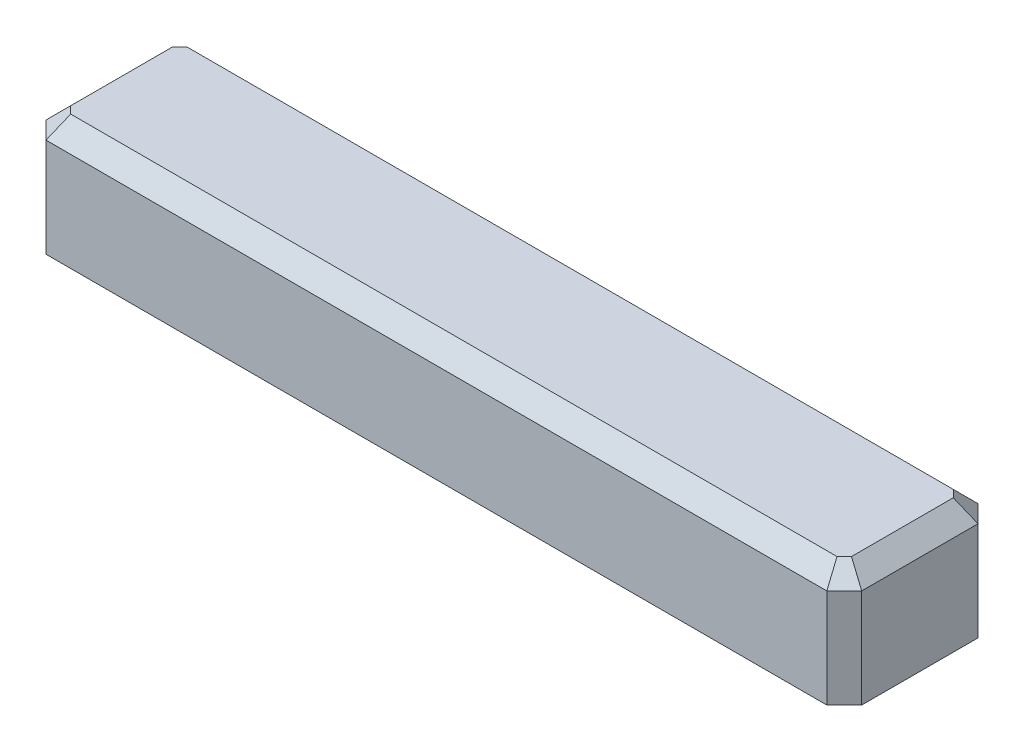
ISO-10303-21;
HEADER;
FILE_DESCRIPTION(('STEP AP214'),'2;1');
FILE_NAME('part.step','',(''),(''),'','','');
FILE_SCHEMA(('AUTOMOTIVE_DESIGN { 1 0 10303 214 1 1 1 1 }'));
ENDSEC;
DATA;
#1=APPLICATION_CONTEXT('core data for automotive mechanical design processes');
#2=APPLICATION_PROTOCOL_DEFINITION('international standard','automotive_design',2000,#1);
#3=PRODUCT_CONTEXT('',#1,'mechanical');
#4=PRODUCT('Part','Part','',(#3));
#5=PRODUCT_RELATED_PRODUCT_CATEGORY('part','',(#4));
#6=PRODUCT_DEFINITION_FORMATION('','',#4);
#7=PRODUCT_DEFINITION_CONTEXT('part definition',#1,'design');
#8=PRODUCT_DEFINITION('design','',#6,#7);
#9=PRODUCT_DEFINITION_SHAPE('','',#8);
#10=(LENGTH_UNIT() NAMED_UNIT(*) SI_UNIT(.MILLI.,.METRE.));
#11=(NAMED_UNIT(*) PLANE_ANGLE_UNIT() SI_UNIT($,.RADIAN.));
#12=(NAMED_UNIT(*) SI_UNIT($,.STERADIAN.) SOLID_ANGLE_UNIT());
#13=UNCERTAINTY_MEASURE_WITH_UNIT(LENGTH_MEASURE(1.E-05),#10,'distance_accuracy_value','');
#14=(GEOMETRIC_REPRESENTATION_CONTEXT(3) GLOBAL_UNCERTAINTY_ASSIGNED_CONTEXT((#13)) GLOBAL_UNIT_ASSIGNED_CONTEXT((#10,
#11,#12)) REPRESENTATION_CONTEXT('',''));
#15=CARTESIAN_POINT('',(0.,0.,0.));
#16=DIRECTION('',(0.,0.,1.));
#17=DIRECTION('',(1.,0.,0.));
#18=AXIS2_PLACEMENT_3D('',#15,#16,#17);
#19=CARTESIAN_POINT('',(-35.07,10.,5.));
#20=DIRECTION('',(1.,0.,0.));
#21=DIRECTION('',(0.,0.,-1.));
#22=AXIS2_PLACEMENT_3D('',#19,#20,#21);
#23=PLANE('',#22);
#24=DIRECTION('',(0.,-1.,0.));
#25=VECTOR('',#24,1.);
#26=CARTESIAN_POINT('',(-35.07,10.,5.));
#27=LINE('',#26,#25);
#28=CARTESIAN_POINT('',(-35.07,8.5,5.));
#29=VERTEX_POINT('',#28);
#30=CARTESIAN_POINT('',(-35.07,0.,5.));
#31=VERTEX_POINT('',#30);
#32=EDGE_CURVE('E265',#29,#31,#27,.T.);
#33=ORIENTED_EDGE('',*,*,#32,.F.);
#34=DIRECTION('',(0.,0.,-1.));
#35=VECTOR('',#34,1.);
#36=CARTESIAN_POINT('',(-35.07,8.5,5.));
#37=LINE('',#36,#35);
#38=CARTESIAN_POINT('',(-35.07,8.5,-5.));
#39=VERTEX_POINT('',#38);
#40=EDGE_CURVE('E297',#29,#39,#37,.T.);
#41=ORIENTED_EDGE('',*,*,#40,.T.);
#42=DIRECTION('',(0.,-1.,0.));
#43=VECTOR('',#42,1.);
#44=CARTESIAN_POINT('',(-35.07,10.,-5.));
#45=LINE('',#44,#43);
#46=CARTESIAN_POINT('',(-35.07,0.,-5.));
#47=VERTEX_POINT('',#46);
#48=EDGE_CURVE('E244',#39,#47,#45,.T.);
#49=ORIENTED_EDGE('',*,*,#48,.T.);
#50=DIRECTION('',(0.,0.,1.));
#51=VECTOR('',#50,1.);
#52=CARTESIAN_POINT('',(-35.07,0.,5.));
#53=LINE('',#52,#51);
#54=EDGE_CURVE('E212',#47,#31,#53,.T.);
#55=ORIENTED_EDGE('',*,*,#54,.T.);
#56=EDGE_LOOP('',(#33,#41,#49,#55));
#57=FACE_BOUND('',#56,.T.);
#58=ADVANCED_FACE('F45',(#57),#23,.F.);
#59=CARTESIAN_POINT('',(-35.07,10.,5.));
#60=DIRECTION('',(0.707106781186548,0.,-0.707106781186548));
#61=DIRECTION('',(-0.707106781186548,0.,-0.707106781186548));
#62=AXIS2_PLACEMENT_3D('',#59,#60,#61);
#63=PLANE('',#62);
#64=DIRECTION('',(0.,-1.,0.));
#65=VECTOR('',#64,1.);
#66=CARTESIAN_POINT('',(-33.57,10.,6.5));
#67=LINE('',#66,#65);
#68=CARTESIAN_POINT('',(-33.57,8.5,6.5));
#69=VERTEX_POINT('',#68);
#70=CARTESIAN_POINT('',(-33.57,0.,6.5));
#71=VERTEX_POINT('',#70);
#72=EDGE_CURVE('E262',#69,#71,#67,.T.);
#73=ORIENTED_EDGE('',*,*,#72,.F.);
#74=DIRECTION('',(-0.707106781186548,0.,-0.707106781186548));
#75=VECTOR('',#74,1.);
#76=CARTESIAN_POINT('',(-35.07,8.5,5.));
#77=LINE('',#76,#75);
#78=EDGE_CURVE('E293',#69,#29,#77,.T.);
#79=ORIENTED_EDGE('',*,*,#78,.T.);
#80=ORIENTED_EDGE('',*,*,#32,.T.);
#81=DIRECTION('',(0.707106781186547,0.,0.707106781186547));
#82=VECTOR('',#81,1.);
#83=CARTESIAN_POINT('',(-35.07,0.,5.));
#84=LINE('',#83,#82);
#85=EDGE_CURVE('E216',#31,#71,#84,.T.);
#86=ORIENTED_EDGE('',*,*,#85,.T.);
#87=EDGE_LOOP('',(#73,#79,#80,#86));
#88=FACE_BOUND('',#87,.T.);
#89=ADVANCED_FACE('F401',(#88),#63,.F.);
#90=CARTESIAN_POINT('',(-33.57,10.,6.5));
#91=DIRECTION('',(0.,0.,-1.));
#92=DIRECTION('',(-1.,0.,0.));
#93=AXIS2_PLACEMENT_3D('',#90,#91,#92);
#94=PLANE('',#93);
#95=DIRECTION('',(0.,-1.,0.));
#96=VECTOR('',#95,1.);
#97=CARTESIAN_POINT('',(33.57,10.,6.5));
#98=LINE('',#97,#96);
#99=CARTESIAN_POINT('',(33.57,8.5,6.5));
#100=VERTEX_POINT('',#99);
#101=CARTESIAN_POINT('',(33.57,0.,6.5));
#102=VERTEX_POINT('',#101);
#103=EDGE_CURVE('E259',#100,#102,#98,.T.);
#104=ORIENTED_EDGE('',*,*,#103,.F.);
#105=DIRECTION('',(-1.,0.,0.));
#106=VECTOR('',#105,1.);
#107=CARTESIAN_POINT('',(-33.57,8.5,6.5));
#108=LINE('',#107,#106);
#109=EDGE_CURVE('E11',#100,#69,#108,.T.);
#110=ORIENTED_EDGE('',*,*,#109,.T.);
#111=ORIENTED_EDGE('',*,*,#72,.T.);
#112=DIRECTION('',(1.,0.,0.));
#113=VECTOR('',#112,1.);
#114=CARTESIAN_POINT('',(-33.57,0.,6.5));
#115=LINE('',#114,#113);
#116=EDGE_CURVE('E220',#71,#102,#115,.T.);
#117=ORIENTED_EDGE('',*,*,#116,.T.);
#118=EDGE_LOOP('',(#104,#110,#111,#117));
#119=FACE_BOUND('',#118,.T.);
#120=ADVANCED_FACE('F398',(#119),#94,.F.);
#121=CARTESIAN_POINT('',(33.57,10.,6.5));
#122=DIRECTION('',(-0.707106781186546,0.,-0.707106781186549));
#123=DIRECTION('',(-0.707106781186549,0.,0.707106781186546));
#124=AXIS2_PLACEMENT_3D('',#121,#122,#123);
#125=PLANE('',#124);
#126=DIRECTION('',(0.,-1.,0.));
#127=VECTOR('',#126,1.);
#128=CARTESIAN_POINT('',(35.07,10.,5.));
#129=LINE('',#128,#127);
#130=CARTESIAN_POINT('',(35.07,8.5,5.));
#131=VERTEX_POINT('',#130);
#132=CARTESIAN_POINT('',(35.07,0.,5.));
#133=VERTEX_POINT('',#132);
#134=EDGE_CURVE('E256',#131,#133,#129,.T.);
#135=ORIENTED_EDGE('',*,*,#134,.F.);
#136=DIRECTION('',(-0.707106781186549,0.,0.707106781186546));
#137=VECTOR('',#136,1.);
#138=CARTESIAN_POINT('',(33.57,8.5,6.5));
#139=LINE('',#138,#137);
#140=EDGE_CURVE('E56',#131,#100,#139,.T.);
#141=ORIENTED_EDGE('',*,*,#140,.T.);
#142=ORIENTED_EDGE('',*,*,#103,.T.);
#143=DIRECTION('',(0.707106781186549,0.,-0.707106781186546));
#144=VECTOR('',#143,1.);
#145=CARTESIAN_POINT('',(33.57,0.,6.5));
#146=LINE('',#145,#144);
#147=EDGE_CURVE('E224',#102,#133,#146,.T.);
#148=ORIENTED_EDGE('',*,*,#147,.T.);
#149=EDGE_LOOP('',(#135,#141,#142,#148));
#150=FACE_BOUND('',#149,.T.);
#151=ADVANCED_FACE('F427',(#150),#125,.F.);
#152=CARTESIAN_POINT('',(35.07,10.,5.));
#153=DIRECTION('',(-1.,0.,0.));
#154=DIRECTION('',(0.,0.,1.));
#155=AXIS2_PLACEMENT_3D('',#152,#153,#154);
#156=PLANE('',#155);
#157=DIRECTION('',(0.,-1.,0.));
#158=VECTOR('',#157,1.);
#159=CARTESIAN_POINT('',(35.07,10.,-5.));
#160=LINE('',#159,#158);
#161=CARTESIAN_POINT('',(35.07,8.5,-5.));
#162=VERTEX_POINT('',#161);
#163=CARTESIAN_POINT('',(35.07,0.,-5.));
#164=VERTEX_POINT('',#163);
#165=EDGE_CURVE('E253',#162,#164,#160,.T.);
#166=ORIENTED_EDGE('',*,*,#165,.F.);
#167=DIRECTION('',(0.,0.,1.));
#168=VECTOR('',#167,1.);
#169=CARTESIAN_POINT('',(35.07,8.5,5.));
#170=LINE('',#169,#168);
#171=EDGE_CURVE('E309',#162,#131,#170,.T.);
#172=ORIENTED_EDGE('',*,*,#171,.T.);
#173=ORIENTED_EDGE('',*,*,#134,.T.);
#174=DIRECTION('',(0.,0.,-1.));
#175=VECTOR('',#174,1.);
#176=CARTESIAN_POINT('',(35.07,0.,5.));
#177=LINE('',#176,#175);
#178=EDGE_CURVE('E228',#133,#164,#177,.T.);
#179=ORIENTED_EDGE('',*,*,#178,.T.);
#180=EDGE_LOOP('',(#166,#172,#173,#179));
#181=FACE_BOUND('',#180,.T.);
#182=ADVANCED_FACE('F357',(#181),#156,.F.);
#183=CARTESIAN_POINT('',(33.57,10.,-6.5));
#184=DIRECTION('',(-0.707106781186546,0.,0.707106781186549));
#185=DIRECTION('',(0.707106781186549,0.,0.707106781186546));
#186=AXIS2_PLACEMENT_3D('',#183,#184,#185);
#187=PLANE('',#186);
#188=DIRECTION('',(0.,-1.,0.));
#189=VECTOR('',#188,1.);
#190=CARTESIAN_POINT('',(33.57,10.,-6.5));
#191=LINE('',#190,#189);
#192=CARTESIAN_POINT('',(33.57,8.5,-6.5));
#193=VERTEX_POINT('',#192);
#194=CARTESIAN_POINT('',(33.57,0.,-6.5));
#195=VERTEX_POINT('',#194);
#196=EDGE_CURVE('E250',#193,#195,#191,.T.);
#197=ORIENTED_EDGE('',*,*,#196,.F.);
#198=DIRECTION('',(0.707106781186549,0.,0.707106781186546));
#199=VECTOR('',#198,1.);
#200=CARTESIAN_POINT('',(33.57,8.5,-6.5));
#201=LINE('',#200,#199);
#202=EDGE_CURVE('E306',#193,#162,#201,.T.);
#203=ORIENTED_EDGE('',*,*,#202,.T.);
#204=ORIENTED_EDGE('',*,*,#165,.T.);
#205=DIRECTION('',(-0.707106781186549,0.,-0.707106781186546));
#206=VECTOR('',#205,1.);
#207=CARTESIAN_POINT('',(33.57,0.,-6.5));
#208=LINE('',#207,#206);
#209=EDGE_CURVE('E232',#164,#195,#208,.T.);
#210=ORIENTED_EDGE('',*,*,#209,.T.);
#211=EDGE_LOOP('',(#197,#203,#204,#210));
#212=FACE_BOUND('',#211,.T.);
#213=ADVANCED_FACE('F355',(#212),#187,.F.);
#214=CARTESIAN_POINT('',(-33.57,10.,-6.5));
#215=DIRECTION('',(0.,0.,1.));
#216=DIRECTION('',(1.,0.,0.));
#217=AXIS2_PLACEMENT_3D('',#214,#215,#216);
#218=PLANE('',#217);
#219=DIRECTION('',(0.,-1.,0.));
#220=VECTOR('',#219,1.);
#221=CARTESIAN_POINT('',(-33.57,10.,-6.5));
#222=LINE('',#221,#220);
#223=CARTESIAN_POINT('',(-33.57,8.5,-6.5));
#224=VERTEX_POINT('',#223);
#225=CARTESIAN_POINT('',(-33.57,0.,-6.5));
#226=VERTEX_POINT('',#225);
#227=EDGE_CURVE('E247',#224,#226,#222,.T.);
#228=ORIENTED_EDGE('',*,*,#227,.F.);
#229=DIRECTION('',(1.,0.,0.));
#230=VECTOR('',#229,1.);
#231=CARTESIAN_POINT('',(-33.57,8.5,-6.5));
#232=LINE('',#231,#230);
#233=EDGE_CURVE('E303',#224,#193,#232,.T.);
#234=ORIENTED_EDGE('',*,*,#233,.T.);
#235=ORIENTED_EDGE('',*,*,#196,.T.);
#236=DIRECTION('',(-1.,0.,0.));
#237=VECTOR('',#236,1.);
#238=CARTESIAN_POINT('',(-33.57,0.,-6.5));
#239=LINE('',#238,#237);
#240=EDGE_CURVE('E236',#195,#226,#239,.T.);
#241=ORIENTED_EDGE('',*,*,#240,.T.);
#242=EDGE_LOOP('',(#228,#234,#235,#241));
#243=FACE_BOUND('',#242,.T.);
#244=ADVANCED_FACE('F368',(#243),#218,.F.);
#245=CARTESIAN_POINT('',(-35.07,10.,-5.));
#246=DIRECTION('',(0.707106781186548,0.,0.707106781186548));
#247=DIRECTION('',(0.707106781186548,0.,-0.707106781186548));
#248=AXIS2_PLACEMENT_3D('',#245,#246,#247);
#249=PLANE('',#248);
#250=ORIENTED_EDGE('',*,*,#48,.F.);
#251=DIRECTION('',(0.707106781186548,0.,-0.707106781186548));
#252=VECTOR('',#251,1.);
#253=CARTESIAN_POINT('',(-35.07,8.5,-5.));
#254=LINE('',#253,#252);
#255=EDGE_CURVE('E300',#39,#224,#254,.T.);
#256=ORIENTED_EDGE('',*,*,#255,.T.);
#257=ORIENTED_EDGE('',*,*,#227,.T.);
#258=DIRECTION('',(-0.707106781186547,0.,0.707106781186547));
#259=VECTOR('',#258,1.);
#260=CARTESIAN_POINT('',(-35.07,0.,-5.));
#261=LINE('',#260,#259);
#262=EDGE_CURVE('E240',#226,#47,#261,.T.);
#263=ORIENTED_EDGE('',*,*,#262,.T.);
#264=EDGE_LOOP('',(#250,#256,#257,#263));
#265=FACE_BOUND('',#264,.T.);
#266=ADVANCED_FACE('F371',(#265),#249,.F.);
#267=CARTESIAN_POINT('',(0.,10.,0.));
#268=DIRECTION('',(0.,-1.,0.));
#269=DIRECTION('',(0.,0.,-1.));
#270=AXIS2_PLACEMENT_3D('',#267,#268,#269);
#271=PLANE('',#270);
#272=DIRECTION('',(0.,0.,1.));
#273=VECTOR('',#272,1.);
#274=CARTESIAN_POINT('',(-33.57,10.,0.));
#275=LINE('',#274,#273);
#276=CARTESIAN_POINT('',(-33.57,10.,-4.37867965644035));
#277=VERTEX_POINT('',#276);
#278=CARTESIAN_POINT('',(-33.57,10.,4.37867965644035));
#279=VERTEX_POINT('',#278);
#280=EDGE_CURVE('E286',#277,#279,#275,.T.);
#281=ORIENTED_EDGE('',*,*,#280,.T.);
#282=DIRECTION('',(0.707106781186548,0.,0.707106781186548));
#283=VECTOR('',#282,1.);
#284=CARTESIAN_POINT('',(-18.9743398282202,10.,18.9743398282202));
#285=LINE('',#284,#283);
#286=CARTESIAN_POINT('',(-32.9486796564403,10.,5.00000000000001));
#287=VERTEX_POINT('',#286);
#288=EDGE_CURVE('E289',#279,#287,#285,.T.);
#289=ORIENTED_EDGE('',*,*,#288,.T.);
#290=DIRECTION('',(1.,0.,0.));
#291=VECTOR('',#290,1.);
#292=CARTESIAN_POINT('',(0.,10.,5.00000000000001));
#293=LINE('',#292,#291);
#294=CARTESIAN_POINT('',(32.9486796564403,10.,5.00000000000001));
#295=VERTEX_POINT('',#294);
#296=EDGE_CURVE('E268',#287,#295,#293,.T.);
#297=ORIENTED_EDGE('',*,*,#296,.T.);
#298=DIRECTION('',(0.707106781186549,0.,-0.707106781186546));
#299=VECTOR('',#298,1.);
#300=CARTESIAN_POINT('',(18.9743398282201,10.,18.9743398282202));
#301=LINE('',#300,#299);
#302=CARTESIAN_POINT('',(33.57,10.,4.37867965644035));
#303=VERTEX_POINT('',#302);
#304=EDGE_CURVE('E271',#295,#303,#301,.T.);
#305=ORIENTED_EDGE('',*,*,#304,.T.);
#306=DIRECTION('',(0.,0.,-1.));
#307=VECTOR('',#306,1.);
#308=CARTESIAN_POINT('',(33.57,10.,0.));
#309=LINE('',#308,#307);
#310=CARTESIAN_POINT('',(33.57,10.,-4.37867965644035));
#311=VERTEX_POINT('',#310);
#312=EDGE_CURVE('E274',#303,#311,#309,.T.);
#313=ORIENTED_EDGE('',*,*,#312,.T.);
#314=DIRECTION('',(-0.707106781186549,0.,-0.707106781186546));
#315=VECTOR('',#314,1.);
#316=CARTESIAN_POINT('',(18.9743398282201,10.,-18.9743398282202));
#317=LINE('',#316,#315);
#318=CARTESIAN_POINT('',(32.9486796564403,10.,-5.00000000000001));
#319=VERTEX_POINT('',#318);
#320=EDGE_CURVE('E277',#311,#319,#317,.T.);
#321=ORIENTED_EDGE('',*,*,#320,.T.);
#322=DIRECTION('',(-1.,0.,0.));
#323=VECTOR('',#322,1.);
#324=CARTESIAN_POINT('',(0.,10.,-5.00000000000001));
#325=LINE('',#324,#323);
#326=CARTESIAN_POINT('',(-32.9486796564403,10.,-5.00000000000001));
#327=VERTEX_POINT('',#326);
#328=EDGE_CURVE('E280',#319,#327,#325,.T.);
#329=ORIENTED_EDGE('',*,*,#328,.T.);
#330=DIRECTION('',(-0.707106781186548,0.,0.707106781186548));
#331=VECTOR('',#330,1.);
#332=CARTESIAN_POINT('',(-18.9743398282202,10.,-18.9743398282202));
#333=LINE('',#332,#331);
#334=EDGE_CURVE('E283',#327,#277,#333,.T.);
#335=ORIENTED_EDGE('',*,*,#334,.T.);
#336=EDGE_LOOP('',(#281,#289,#297,#305,#313,#321,#329,#335));
#337=FACE_BOUND('',#336,.T.);
#338=ADVANCED_FACE('F384',(#337),#271,.F.);
#339=CARTESIAN_POINT('',(0.,0.,0.));
#340=DIRECTION('',(0.,-1.,0.));
#341=DIRECTION('',(0.,0.,-1.));
#342=AXIS2_PLACEMENT_3D('',#339,#340,#341);
#343=PLANE('',#342);
#344=DIRECTION('',(0.,0.,-1.));
#345=VECTOR('',#344,1.);
#346=CARTESIAN_POINT('',(-30.67,0.,1.3));
#347=LINE('',#346,#345);
#348=CARTESIAN_POINT('',(-30.67,0.,1.3));
#349=VERTEX_POINT('',#348);
#350=CARTESIAN_POINT('',(-30.67,0.,-2.5));
#351=VERTEX_POINT('',#350);
#352=EDGE_CURVE('E64',#349,#351,#347,.T.);
#353=ORIENTED_EDGE('',*,*,#352,.F.);
#354=DIRECTION('',(-1.,0.,0.));
#355=VECTOR('',#354,1.);
#356=CARTESIAN_POINT('',(-30.67,0.,1.3));
#357=LINE('',#356,#355);
#358=CARTESIAN_POINT('',(30.67,0.,1.30000000000004));
#359=VERTEX_POINT('',#358);
#360=EDGE_CURVE('E184',#359,#349,#357,.T.);
#361=ORIENTED_EDGE('',*,*,#360,.F.);
#362=DIRECTION('',(0.,0.,1.));
#363=VECTOR('',#362,1.);
#364=CARTESIAN_POINT('',(30.67,0.,1.30000000000004));
#365=LINE('',#364,#363);
#366=CARTESIAN_POINT('',(30.67,0.,-2.5));
#367=VERTEX_POINT('',#366);
#368=EDGE_CURVE('E188',#367,#359,#365,.T.);
#369=ORIENTED_EDGE('',*,*,#368,.F.);
#370=DIRECTION('',(1.,0.,0.));
#371=VECTOR('',#370,1.);
#372=CARTESIAN_POINT('',(-30.67,0.,-2.5));
#373=LINE('',#372,#371);
#374=EDGE_CURVE('E197',#351,#367,#373,.T.);
#375=ORIENTED_EDGE('',*,*,#374,.F.);
#376=EDGE_LOOP('',(#353,#361,#369,#375));
#377=FACE_BOUND('',#376,.T.);
#378=ORIENTED_EDGE('',*,*,#54,.F.);
#379=ORIENTED_EDGE('',*,*,#262,.F.);
#380=ORIENTED_EDGE('',*,*,#240,.F.);
#381=ORIENTED_EDGE('',*,*,#209,.F.);
#382=ORIENTED_EDGE('',*,*,#178,.F.);
#383=ORIENTED_EDGE('',*,*,#147,.F.);
#384=ORIENTED_EDGE('',*,*,#116,.F.);
#385=ORIENTED_EDGE('',*,*,#85,.F.);
#386=EDGE_LOOP('',(#378,#379,#380,#381,#382,#383,#384,#385));
#387=FACE_BOUND('',#386,.T.);
#388=ADVANCED_FACE('F364',(#377,#387),#343,.T.);
#389=CARTESIAN_POINT('',(18.9743398282201,10.,-18.9743398282202));
#390=DIRECTION('',(-0.499999999999999,-0.707106781186548,0.500000000000001));
#391=DIRECTION('',(-0.707106781186549,0.,-0.707106781186546));
#392=AXIS2_PLACEMENT_3D('',#389,#390,#391);
#393=PLANE('',#392);
#394=DIRECTION('',(-0.678598344545844,0.678598344545847,0.281084637714826));
#395=VECTOR('',#394,1.);
#396=CARTESIAN_POINT('',(32.7347950111862,10.8352049888138,-4.03272642271198));
#397=LINE('',#396,#395);
#398=EDGE_CURVE('E334',#162,#311,#397,.T.);
#399=ORIENTED_EDGE('',*,*,#398,.F.);
#400=ORIENTED_EDGE('',*,*,#202,.F.);
#401=DIRECTION('',(-0.281084637714824,0.678598344545848,0.678598344545845));
#402=VECTOR('',#401,1.);
#403=CARTESIAN_POINT('',(34.51010246504,6.23039187887997,-8.76960812112002));
#404=LINE('',#403,#402);
#405=EDGE_CURVE('E50',#319,#193,#404,.F.);
#406=ORIENTED_EDGE('',*,*,#405,.F.);
#407=ORIENTED_EDGE('',*,*,#320,.F.);
#408=EDGE_LOOP('',(#399,#400,#406,#407));
#409=FACE_BOUND('',#408,.T.);
#410=ADVANCED_FACE('F48',(#409),#393,.F.);
#411=CARTESIAN_POINT('',(0.,10.,-5.00000000000001));
#412=DIRECTION('',(0.,-0.707106781186546,0.707106781186549));
#413=DIRECTION('',(-1.,0.,0.));
#414=AXIS2_PLACEMENT_3D('',#411,#412,#413);
#415=PLANE('',#414);
#416=ORIENTED_EDGE('',*,*,#405,.T.);
#417=ORIENTED_EDGE('',*,*,#233,.F.);
#418=DIRECTION('',(0.281084637714824,0.678598344545848,0.678598344545845));
#419=VECTOR('',#418,1.);
#420=CARTESIAN_POINT('',(-30.3454514761235,16.2847487788726,1.28474877887258));
#421=LINE('',#420,#419);
#422=EDGE_CURVE('E331',#327,#224,#421,.F.);
#423=ORIENTED_EDGE('',*,*,#422,.F.);
#424=ORIENTED_EDGE('',*,*,#328,.F.);
#425=EDGE_LOOP('',(#416,#417,#423,#424));
#426=FACE_BOUND('',#425,.T.);
#427=ADVANCED_FACE('F347',(#426),#415,.F.);
#428=CARTESIAN_POINT('',(33.57,10.,0.));
#429=DIRECTION('',(-0.707106781186549,-0.707106781186546,0.));
#430=DIRECTION('',(0.,0.,-1.));
#431=AXIS2_PLACEMENT_3D('',#428,#429,#430);
#432=PLANE('',#431);
#433=ORIENTED_EDGE('',*,*,#398,.T.);
#434=ORIENTED_EDGE('',*,*,#312,.F.);
#435=DIRECTION('',(-0.678598344545844,0.678598344545847,-0.281084637714826));
#436=VECTOR('',#435,1.);
#437=CARTESIAN_POINT('',(29.6327893844731,13.937210615527,2.74783362156972));
#438=LINE('',#437,#436);
#439=EDGE_CURVE('E327',#131,#303,#438,.T.);
#440=ORIENTED_EDGE('',*,*,#439,.F.);
#441=ORIENTED_EDGE('',*,*,#171,.F.);
#442=EDGE_LOOP('',(#433,#434,#440,#441));
#443=FACE_BOUND('',#442,.T.);
#444=ADVANCED_FACE('F387',(#443),#432,.F.);
#445=CARTESIAN_POINT('',(-18.9743398282202,10.,-18.9743398282202));
#446=DIRECTION('',(0.5,-0.707106781186547,0.5));
#447=DIRECTION('',(-0.707106781186548,0.,0.707106781186548));
#448=AXIS2_PLACEMENT_3D('',#445,#446,#447);
#449=PLANE('',#448);
#450=ORIENTED_EDGE('',*,*,#422,.T.);
#451=ORIENTED_EDGE('',*,*,#255,.F.);
#452=DIRECTION('',(0.678598344545845,0.678598344545848,0.281084637714824));
#453=VECTOR('',#452,1.);
#454=CARTESIAN_POINT('',(-29.6327893844731,13.937210615527,-2.74783362156974));
#455=LINE('',#454,#453);
#456=EDGE_CURVE('E323',#277,#39,#455,.F.);
#457=ORIENTED_EDGE('',*,*,#456,.F.);
#458=ORIENTED_EDGE('',*,*,#334,.F.);
#459=EDGE_LOOP('',(#450,#451,#457,#458));
#460=FACE_BOUND('',#459,.T.);
#461=ADVANCED_FACE('F375',(#460),#449,.F.);
#462=CARTESIAN_POINT('',(18.9743398282201,10.,18.9743398282202));
#463=DIRECTION('',(-0.499999999999999,-0.707106781186548,-0.500000000000001));
#464=DIRECTION('',(0.707106781186549,0.,-0.707106781186546));
#465=AXIS2_PLACEMENT_3D('',#462,#463,#464);
#466=PLANE('',#465);
#467=ORIENTED_EDGE('',*,*,#439,.T.);
#468=ORIENTED_EDGE('',*,*,#304,.F.);
#469=DIRECTION('',(-0.281084637714824,0.678598344545848,-0.678598344545845));
#470=VECTOR('',#469,1.);
#471=CARTESIAN_POINT('',(30.3454514761235,16.2847487788726,-1.28474877887258));
#472=LINE('',#471,#470);
#473=EDGE_CURVE('E319',#100,#295,#472,.T.);
#474=ORIENTED_EDGE('',*,*,#473,.F.);
#475=ORIENTED_EDGE('',*,*,#140,.F.);
#476=EDGE_LOOP('',(#467,#468,#474,#475));
#477=FACE_BOUND('',#476,.T.);
#478=ADVANCED_FACE('F389',(#477),#466,.F.);
#479=CARTESIAN_POINT('',(-33.57,10.,0.));
#480=DIRECTION('',(0.707106781186549,-0.707106781186546,0.));
#481=DIRECTION('',(0.,0.,1.));
#482=AXIS2_PLACEMENT_3D('',#479,#480,#481);
#483=PLANE('',#482);
#484=ORIENTED_EDGE('',*,*,#456,.T.);
#485=ORIENTED_EDGE('',*,*,#40,.F.);
#486=DIRECTION('',(0.678598344545845,0.678598344545848,-0.281084637714824));
#487=VECTOR('',#486,1.);
#488=CARTESIAN_POINT('',(-32.7347950111862,10.8352049888138,4.03272642271199));
#489=LINE('',#488,#487);
#490=EDGE_CURVE('E316',#279,#29,#489,.F.);
#491=ORIENTED_EDGE('',*,*,#490,.F.);
#492=ORIENTED_EDGE('',*,*,#280,.F.);
#493=EDGE_LOOP('',(#484,#485,#491,#492));
#494=FACE_BOUND('',#493,.T.);
#495=ADVANCED_FACE('F380',(#494),#483,.F.);
#496=CARTESIAN_POINT('',(0.,10.,5.00000000000001));
#497=DIRECTION('',(0.,-0.707106781186546,-0.707106781186549));
#498=DIRECTION('',(1.,0.,0.));
#499=AXIS2_PLACEMENT_3D('',#496,#497,#498);
#500=PLANE('',#499);
#501=ORIENTED_EDGE('',*,*,#473,.T.);
#502=ORIENTED_EDGE('',*,*,#296,.F.);
#503=DIRECTION('',(-0.281084637714824,-0.678598344545848,0.678598344545845));
#504=VECTOR('',#503,1.);
#505=CARTESIAN_POINT('',(-30.3454514761235,16.2847487788726,-1.28474877887258));
#506=LINE('',#505,#504);
#507=EDGE_CURVE('E206',#69,#287,#506,.F.);
#508=ORIENTED_EDGE('',*,*,#507,.F.);
#509=ORIENTED_EDGE('',*,*,#109,.F.);
#510=EDGE_LOOP('',(#501,#502,#508,#509));
#511=FACE_BOUND('',#510,.T.);
#512=ADVANCED_FACE('F395',(#511),#500,.F.);
#513=CARTESIAN_POINT('',(-18.9743398282202,10.,18.9743398282202));
#514=DIRECTION('',(0.5,-0.707106781186547,-0.5));
#515=DIRECTION('',(0.707106781186548,0.,0.707106781186548));
#516=AXIS2_PLACEMENT_3D('',#513,#514,#515);
#517=PLANE('',#516);
#518=ORIENTED_EDGE('',*,*,#490,.T.);
#519=ORIENTED_EDGE('',*,*,#78,.F.);
#520=ORIENTED_EDGE('',*,*,#507,.T.);
#521=ORIENTED_EDGE('',*,*,#288,.F.);
#522=EDGE_LOOP('',(#518,#519,#520,#521));
#523=FACE_BOUND('',#522,.T.);
#524=ADVANCED_FACE('F406',(#523),#517,.F.);
#525=CARTESIAN_POINT('',(-30.67,7.,1.3));
#526=DIRECTION('',(-1.,0.,0.));
#527=DIRECTION('',(0.,0.,1.));
#528=AXIS2_PLACEMENT_3D('',#525,#526,#527);
#529=PLANE('',#528);
#530=ORIENTED_EDGE('',*,*,#352,.T.);
#531=DIRECTION('',(0.,-1.,0.));
#532=VECTOR('',#531,1.);
#533=CARTESIAN_POINT('',(-30.67,7.,-2.5));
#534=LINE('',#533,#532);
#535=CARTESIAN_POINT('',(-30.67,7.,-2.5));
#536=VERTEX_POINT('',#535);
#537=EDGE_CURVE('E159',#536,#351,#534,.T.);
#538=ORIENTED_EDGE('',*,*,#537,.F.);
#539=DIRECTION('',(0.,0.,-1.));
#540=VECTOR('',#539,1.);
#541=CARTESIAN_POINT('',(-30.67,7.,1.3));
#542=LINE('',#541,#540);
#543=CARTESIAN_POINT('',(-30.67,7.,1.3));
#544=VERTEX_POINT('',#543);
#545=EDGE_CURVE('E163',#544,#536,#542,.T.);
#546=ORIENTED_EDGE('',*,*,#545,.F.);
#547=DIRECTION('',(0.,-1.,0.));
#548=VECTOR('',#547,1.);
#549=CARTESIAN_POINT('',(-30.67,7.,1.3));
#550=LINE('',#549,#548);
#551=EDGE_CURVE('E203',#544,#349,#550,.T.);
#552=ORIENTED_EDGE('',*,*,#551,.T.);
#553=EDGE_LOOP('',(#530,#538,#546,#552));
#554=FACE_BOUND('',#553,.T.);
#555=ADVANCED_FACE('F161',(#554),#529,.F.);
#556=CARTESIAN_POINT('',(-30.67,7.,1.3));
#557=DIRECTION('',(0.,0.,1.));
#558=DIRECTION('',(1.,0.,0.));
#559=AXIS2_PLACEMENT_3D('',#556,#557,#558);
#560=PLANE('',#559);
#561=ORIENTED_EDGE('',*,*,#360,.T.);
#562=ORIENTED_EDGE('',*,*,#551,.F.);
#563=DIRECTION('',(-1.,0.,0.));
#564=VECTOR('',#563,1.);
#565=CARTESIAN_POINT('',(-30.67,7.,1.3));
#566=LINE('',#565,#564);
#567=CARTESIAN_POINT('',(30.67,7.,1.30000000000004));
#568=VERTEX_POINT('',#567);
#569=EDGE_CURVE('E170',#568,#544,#566,.T.);
#570=ORIENTED_EDGE('',*,*,#569,.F.);
#571=DIRECTION('',(0.,-1.,0.));
#572=VECTOR('',#571,1.);
#573=CARTESIAN_POINT('',(30.67,7.,1.30000000000004));
#574=LINE('',#573,#572);
#575=EDGE_CURVE('E207',#568,#359,#574,.T.);
#576=ORIENTED_EDGE('',*,*,#575,.T.);
#577=EDGE_LOOP('',(#561,#562,#570,#576));
#578=FACE_BOUND('',#577,.T.);
#579=ADVANCED_FACE('F413',(#578),#560,.F.);
#580=CARTESIAN_POINT('',(30.67,7.,1.30000000000004));
#581=DIRECTION('',(1.,0.,0.));
#582=DIRECTION('',(0.,0.,-1.));
#583=AXIS2_PLACEMENT_3D('',#580,#581,#582);
#584=PLANE('',#583);
#585=ORIENTED_EDGE('',*,*,#368,.T.);
#586=ORIENTED_EDGE('',*,*,#575,.F.);
#587=DIRECTION('',(0.,0.,1.));
#588=VECTOR('',#587,1.);
#589=CARTESIAN_POINT('',(30.67,7.,1.30000000000004));
#590=LINE('',#589,#588);
#591=CARTESIAN_POINT('',(30.67,7.,-2.5));
#592=VERTEX_POINT('',#591);
#593=EDGE_CURVE('E179',#592,#568,#590,.T.);
#594=ORIENTED_EDGE('',*,*,#593,.F.);
#595=DIRECTION('',(0.,-1.,0.));
#596=VECTOR('',#595,1.);
#597=CARTESIAN_POINT('',(30.67,7.,-2.5));
#598=LINE('',#597,#596);
#599=EDGE_CURVE('E169',#592,#367,#598,.T.);
#600=ORIENTED_EDGE('',*,*,#599,.T.);
#601=EDGE_LOOP('',(#585,#586,#594,#600));
#602=FACE_BOUND('',#601,.T.);
#603=ADVANCED_FACE('F445',(#602),#584,.F.);
#604=CARTESIAN_POINT('',(-30.67,7.,-2.5));
#605=DIRECTION('',(0.,0.,-1.));
#606=DIRECTION('',(-1.,0.,0.));
#607=AXIS2_PLACEMENT_3D('',#604,#605,#606);
#608=PLANE('',#607);
#609=ORIENTED_EDGE('',*,*,#374,.T.);
#610=ORIENTED_EDGE('',*,*,#599,.F.);
#611=DIRECTION('',(1.,0.,0.));
#612=VECTOR('',#611,1.);
#613=CARTESIAN_POINT('',(-30.67,7.,-2.5));
#614=LINE('',#613,#612);
#615=EDGE_CURVE('E173',#536,#592,#614,.T.);
#616=ORIENTED_EDGE('',*,*,#615,.F.);
#617=ORIENTED_EDGE('',*,*,#537,.T.);
#618=EDGE_LOOP('',(#609,#610,#616,#617));
#619=FACE_BOUND('',#618,.T.);
#620=ADVANCED_FACE('F174',(#619),#608,.F.);
#621=CARTESIAN_POINT('',(0.,7.,0.));
#622=DIRECTION('',(0.,-1.,0.));
#623=DIRECTION('',(0.,0.,-1.));
#624=AXIS2_PLACEMENT_3D('',#621,#622,#623);
#625=PLANE('',#624);
#626=ORIENTED_EDGE('',*,*,#545,.T.);
#627=ORIENTED_EDGE('',*,*,#615,.T.);
#628=ORIENTED_EDGE('',*,*,#593,.T.);
#629=ORIENTED_EDGE('',*,*,#569,.T.);
#630=EDGE_LOOP('',(#626,#627,#628,#629));
#631=FACE_BOUND('',#630,.T.);
#632=ADVANCED_FACE('F181',(#631),#625,.T.);
#633=CLOSED_SHELL('',(#58,#89,#120,#151,#182,#213,#244,#266,#338,#388,#410,#427,#444,#461,#478,
#495,#512,#524,#555,#579,#603,#620,#632));
#634=MANIFOLD_SOLID_BREP('B2',#633);
#635=ADVANCED_BREP_SHAPE_REPRESENTATION('',(#18,#634),#14);
#636=SHAPE_DEFINITION_REPRESENTATION(#9,#635);
ENDSEC;
END-ISO-10303-21;
